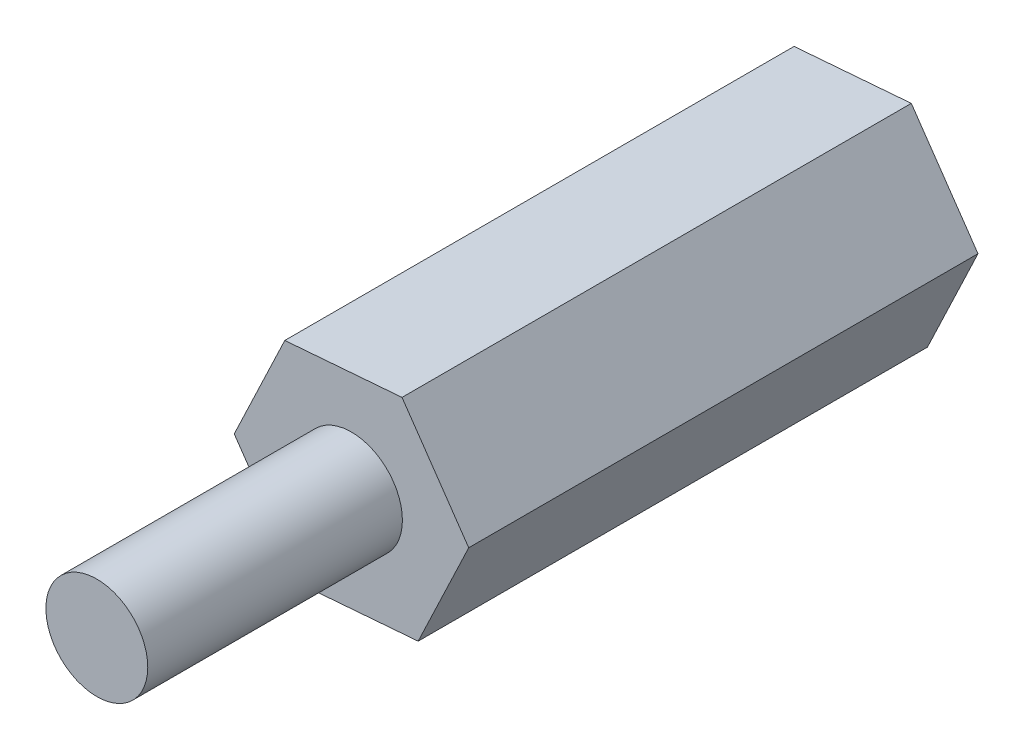
ISO-10303-21;
HEADER;
FILE_DESCRIPTION(('STEP AP214'),'2;1');
FILE_NAME('part.step','',(''),(''),'','','');
FILE_SCHEMA(('AUTOMOTIVE_DESIGN { 1 0 10303 214 1 1 1 1 }'));
ENDSEC;
DATA;
#1=APPLICATION_CONTEXT('core data for automotive mechanical design processes');
#2=APPLICATION_PROTOCOL_DEFINITION('international standard','automotive_design',2000,#1);
#3=PRODUCT_CONTEXT('',#1,'mechanical');
#4=PRODUCT('Part','Part','',(#3));
#5=PRODUCT_RELATED_PRODUCT_CATEGORY('part','',(#4));
#6=PRODUCT_DEFINITION_FORMATION('','',#4);
#7=PRODUCT_DEFINITION_CONTEXT('part definition',#1,'design');
#8=PRODUCT_DEFINITION('design','',#6,#7);
#9=PRODUCT_DEFINITION_SHAPE('','',#8);
#10=(LENGTH_UNIT() NAMED_UNIT(*) SI_UNIT(.MILLI.,.METRE.));
#11=(NAMED_UNIT(*) PLANE_ANGLE_UNIT() SI_UNIT($,.RADIAN.));
#12=(NAMED_UNIT(*) SI_UNIT($,.STERADIAN.) SOLID_ANGLE_UNIT());
#13=UNCERTAINTY_MEASURE_WITH_UNIT(LENGTH_MEASURE(1.E-05),#10,'distance_accuracy_value','');
#14=(GEOMETRIC_REPRESENTATION_CONTEXT(3) GLOBAL_UNCERTAINTY_ASSIGNED_CONTEXT((#13)) GLOBAL_UNIT_ASSIGNED_CONTEXT((#10,
#11,#12)) REPRESENTATION_CONTEXT('',''));
#15=CARTESIAN_POINT('',(0.,0.,0.));
#16=DIRECTION('',(0.,0.,1.));
#17=DIRECTION('',(1.,0.,0.));
#18=AXIS2_PLACEMENT_3D('',#15,#16,#17);
#19=CARTESIAN_POINT('',(1.30949428071029,-1.90225078843994,10.));
#20=DIRECTION('',(-0.90290973205585,0.429830217363592,0.));
#21=DIRECTION('',(-0.429830217363592,-0.90290973205585,0.));
#22=AXIS2_PLACEMENT_3D('',#19,#20,#21);
#23=PLANE('',#22);
#24=DIRECTION('',(0.429830217363592,0.90290973205585,0.));
#25=VECTOR('',#24,1.);
#26=CARTESIAN_POINT('',(1.30949428071029,-1.90225078843994,0.));
#27=LINE('',#26,#25);
#28=CARTESIAN_POINT('',(1.30949428071029,-1.90225078843994,0.));
#29=VERTEX_POINT('',#28);
#30=CARTESIAN_POINT('',(2.30214464751311,0.182929918985571,0.));
#31=VERTEX_POINT('',#30);
#32=EDGE_CURVE('E120',#29,#31,#27,.T.);
#33=ORIENTED_EDGE('',*,*,#32,.T.);
#34=DIRECTION('',(0.,0.,-1.));
#35=VECTOR('',#34,1.);
#36=CARTESIAN_POINT('',(2.30214464751311,0.182929918985571,10.));
#37=LINE('',#36,#35);
#38=CARTESIAN_POINT('',(2.30214464751311,0.182929918985571,10.));
#39=VERTEX_POINT('',#38);
#40=EDGE_CURVE('E37',#39,#31,#37,.T.);
#41=ORIENTED_EDGE('',*,*,#40,.F.);
#42=DIRECTION('',(0.429830217363592,0.90290973205585,0.));
#43=VECTOR('',#42,1.);
#44=CARTESIAN_POINT('',(1.30949428071029,-1.90225078843994,10.));
#45=LINE('',#44,#43);
#46=CARTESIAN_POINT('',(1.30949428071029,-1.90225078843994,10.));
#47=VERTEX_POINT('',#46);
#48=EDGE_CURVE('E131',#47,#39,#45,.T.);
#49=ORIENTED_EDGE('',*,*,#48,.F.);
#50=DIRECTION('',(0.,0.,-1.));
#51=VECTOR('',#50,1.);
#52=CARTESIAN_POINT('',(1.30949428071029,-1.90225078843994,10.));
#53=LINE('',#52,#51);
#54=EDGE_CURVE('E116',#47,#29,#53,.T.);
#55=ORIENTED_EDGE('',*,*,#54,.T.);
#56=EDGE_LOOP('',(#33,#41,#49,#55));
#57=FACE_BOUND('',#56,.T.);
#58=ADVANCED_FACE('F34',(#57),#23,.F.);
#59=CARTESIAN_POINT('',(2.30214464751311,0.182929918985571,10.));
#60=DIRECTION('',(-0.823698753578983,-0.56702765660277,0.));
#61=DIRECTION('',(0.56702765660277,-0.823698753578983,0.));
#62=AXIS2_PLACEMENT_3D('',#59,#60,#61);
#63=PLANE('',#62);
#64=DIRECTION('',(-0.56702765660277,0.823698753578983,0.));
#65=VECTOR('',#64,1.);
#66=CARTESIAN_POINT('',(2.30214464751311,0.182929918985571,0.));
#67=LINE('',#66,#65);
#68=CARTESIAN_POINT('',(0.992650366802822,2.08518070742551,0.));
#69=VERTEX_POINT('',#68);
#70=EDGE_CURVE('E123',#31,#69,#67,.T.);
#71=ORIENTED_EDGE('',*,*,#70,.T.);
#72=DIRECTION('',(0.,0.,-1.));
#73=VECTOR('',#72,1.);
#74=CARTESIAN_POINT('',(0.992650366802822,2.08518070742551,10.));
#75=LINE('',#74,#73);
#76=CARTESIAN_POINT('',(0.992650366802822,2.08518070742551,10.));
#77=VERTEX_POINT('',#76);
#78=EDGE_CURVE('E134',#77,#69,#75,.T.);
#79=ORIENTED_EDGE('',*,*,#78,.F.);
#80=DIRECTION('',(-0.56702765660277,0.823698753578983,0.));
#81=VECTOR('',#80,1.);
#82=CARTESIAN_POINT('',(2.30214464751311,0.182929918985571,10.));
#83=LINE('',#82,#81);
#84=EDGE_CURVE('E89',#39,#77,#83,.T.);
#85=ORIENTED_EDGE('',*,*,#84,.F.);
#86=ORIENTED_EDGE('',*,*,#40,.T.);
#87=EDGE_LOOP('',(#71,#79,#85,#86));
#88=FACE_BOUND('',#87,.T.);
#89=ADVANCED_FACE('F139',(#88),#63,.F.);
#90=CARTESIAN_POINT('',(0.992650366802822,2.08518070742551,10.));
#91=DIRECTION('',(0.0792109784768665,-0.996857873966363,0.));
#92=DIRECTION('',(0.996857873966363,0.0792109784768665,0.));
#93=AXIS2_PLACEMENT_3D('',#90,#91,#92);
#94=PLANE('',#93);
#95=DIRECTION('',(-0.996857873966363,-0.0792109784768665,0.));
#96=VECTOR('',#95,1.);
#97=CARTESIAN_POINT('',(0.992650366802822,2.08518070742551,0.));
#98=LINE('',#97,#96);
#99=CARTESIAN_POINT('',(-1.30949428071029,1.90225078843994,0.));
#100=VERTEX_POINT('',#99);
#101=EDGE_CURVE('E126',#69,#100,#98,.T.);
#102=ORIENTED_EDGE('',*,*,#101,.T.);
#103=DIRECTION('',(0.,0.,-1.));
#104=VECTOR('',#103,1.);
#105=CARTESIAN_POINT('',(-1.30949428071029,1.90225078843994,10.));
#106=LINE('',#105,#104);
#107=CARTESIAN_POINT('',(-1.30949428071029,1.90225078843994,10.));
#108=VERTEX_POINT('',#107);
#109=EDGE_CURVE('E111',#108,#100,#106,.T.);
#110=ORIENTED_EDGE('',*,*,#109,.F.);
#111=DIRECTION('',(-0.996857873966363,-0.0792109784768665,0.));
#112=VECTOR('',#111,1.);
#113=CARTESIAN_POINT('',(0.992650366802822,2.08518070742551,10.));
#114=LINE('',#113,#112);
#115=EDGE_CURVE('E102',#77,#108,#114,.T.);
#116=ORIENTED_EDGE('',*,*,#115,.F.);
#117=ORIENTED_EDGE('',*,*,#78,.T.);
#118=EDGE_LOOP('',(#102,#110,#116,#117));
#119=FACE_BOUND('',#118,.T.);
#120=ADVANCED_FACE('F145',(#119),#94,.F.);
#121=CARTESIAN_POINT('',(-1.30949428071029,1.90225078843994,10.));
#122=DIRECTION('',(0.90290973205585,-0.429830217363592,0.));
#123=DIRECTION('',(0.429830217363592,0.90290973205585,0.));
#124=AXIS2_PLACEMENT_3D('',#121,#122,#123);
#125=PLANE('',#124);
#126=DIRECTION('',(-0.429830217363592,-0.90290973205585,0.));
#127=VECTOR('',#126,1.);
#128=CARTESIAN_POINT('',(-1.30949428071029,1.90225078843994,0.));
#129=LINE('',#128,#127);
#130=CARTESIAN_POINT('',(-2.30214464751311,-0.182929918985571,0.));
#131=VERTEX_POINT('',#130);
#132=EDGE_CURVE('E110',#100,#131,#129,.T.);
#133=ORIENTED_EDGE('',*,*,#132,.T.);
#134=DIRECTION('',(0.,0.,-1.));
#135=VECTOR('',#134,1.);
#136=CARTESIAN_POINT('',(-2.30214464751311,-0.182929918985571,10.));
#137=LINE('',#136,#135);
#138=CARTESIAN_POINT('',(-2.30214464751311,-0.182929918985571,10.));
#139=VERTEX_POINT('',#138);
#140=EDGE_CURVE('E107',#139,#131,#137,.T.);
#141=ORIENTED_EDGE('',*,*,#140,.F.);
#142=DIRECTION('',(-0.429830217363592,-0.90290973205585,0.));
#143=VECTOR('',#142,1.);
#144=CARTESIAN_POINT('',(-1.30949428071029,1.90225078843994,10.));
#145=LINE('',#144,#143);
#146=EDGE_CURVE('E96',#108,#139,#145,.T.);
#147=ORIENTED_EDGE('',*,*,#146,.F.);
#148=ORIENTED_EDGE('',*,*,#109,.T.);
#149=EDGE_LOOP('',(#133,#141,#147,#148));
#150=FACE_BOUND('',#149,.T.);
#151=ADVANCED_FACE('F108',(#150),#125,.F.);
#152=CARTESIAN_POINT('',(-2.30214464751311,-0.182929918985571,10.));
#153=DIRECTION('',(0.823698753578983,0.56702765660277,0.));
#154=DIRECTION('',(-0.56702765660277,0.823698753578983,0.));
#155=AXIS2_PLACEMENT_3D('',#152,#153,#154);
#156=PLANE('',#155);
#157=DIRECTION('',(0.56702765660277,-0.823698753578983,0.));
#158=VECTOR('',#157,1.);
#159=CARTESIAN_POINT('',(-2.30214464751311,-0.182929918985571,0.));
#160=LINE('',#159,#158);
#161=CARTESIAN_POINT('',(-0.992650366802821,-2.08518070742551,0.));
#162=VERTEX_POINT('',#161);
#163=EDGE_CURVE('E74',#131,#162,#160,.T.);
#164=ORIENTED_EDGE('',*,*,#163,.T.);
#165=DIRECTION('',(0.,0.,-1.));
#166=VECTOR('',#165,1.);
#167=CARTESIAN_POINT('',(-0.992650366802821,-2.08518070742551,10.));
#168=LINE('',#167,#166);
#169=CARTESIAN_POINT('',(-0.992650366802821,-2.08518070742551,10.));
#170=VERTEX_POINT('',#169);
#171=EDGE_CURVE('E112',#170,#162,#168,.T.);
#172=ORIENTED_EDGE('',*,*,#171,.F.);
#173=DIRECTION('',(0.56702765660277,-0.823698753578983,0.));
#174=VECTOR('',#173,1.);
#175=CARTESIAN_POINT('',(-2.30214464751311,-0.182929918985571,10.));
#176=LINE('',#175,#174);
#177=EDGE_CURVE('E100',#139,#170,#176,.T.);
#178=ORIENTED_EDGE('',*,*,#177,.F.);
#179=ORIENTED_EDGE('',*,*,#140,.T.);
#180=EDGE_LOOP('',(#164,#172,#178,#179));
#181=FACE_BOUND('',#180,.T.);
#182=ADVANCED_FACE('F114',(#181),#156,.F.);
#183=CARTESIAN_POINT('',(-0.992650366802821,-2.08518070742551,10.));
#184=DIRECTION('',(-0.0792109784768666,0.996857873966363,0.));
#185=DIRECTION('',(-0.996857873966363,-0.0792109784768666,0.));
#186=AXIS2_PLACEMENT_3D('',#183,#184,#185);
#187=PLANE('',#186);
#188=DIRECTION('',(0.996857873966363,0.0792109784768666,0.));
#189=VECTOR('',#188,1.);
#190=CARTESIAN_POINT('',(-0.992650366802821,-2.08518070742551,0.));
#191=LINE('',#190,#189);
#192=EDGE_CURVE('E80',#162,#29,#191,.T.);
#193=ORIENTED_EDGE('',*,*,#192,.T.);
#194=ORIENTED_EDGE('',*,*,#54,.F.);
#195=DIRECTION('',(0.996857873966363,0.0792109784768666,0.));
#196=VECTOR('',#195,1.);
#197=CARTESIAN_POINT('',(-0.992650366802821,-2.08518070742551,10.));
#198=LINE('',#197,#196);
#199=EDGE_CURVE('E51',#170,#47,#198,.T.);
#200=ORIENTED_EDGE('',*,*,#199,.F.);
#201=ORIENTED_EDGE('',*,*,#171,.T.);
#202=EDGE_LOOP('',(#193,#194,#200,#201));
#203=FACE_BOUND('',#202,.T.);
#204=ADVANCED_FACE('F176',(#203),#187,.F.);
#205=CARTESIAN_POINT('',(0.,0.,10.));
#206=DIRECTION('',(0.,0.,1.));
#207=DIRECTION('',(1.,0.,0.));
#208=AXIS2_PLACEMENT_3D('',#205,#206,#207);
#209=PLANE('',#208);
#210=CARTESIAN_POINT('',(0.,0.,10.));
#211=DIRECTION('',(0.,0.,1.));
#212=DIRECTION('',(1.,0.,0.));
#213=AXIS2_PLACEMENT_3D('',#210,#211,#212);
#214=CIRCLE('',#213,1.);
#215=CARTESIAN_POINT('',(1.,0.,10.));
#216=VERTEX_POINT('',#215);
#217=EDGE_CURVE('E11',#216,#216,#214,.T.);
#218=ORIENTED_EDGE('',*,*,#217,.F.);
#219=EDGE_LOOP('',(#218));
#220=FACE_BOUND('',#219,.T.);
#221=ORIENTED_EDGE('',*,*,#48,.T.);
#222=ORIENTED_EDGE('',*,*,#84,.T.);
#223=ORIENTED_EDGE('',*,*,#115,.T.);
#224=ORIENTED_EDGE('',*,*,#146,.T.);
#225=ORIENTED_EDGE('',*,*,#177,.T.);
#226=ORIENTED_EDGE('',*,*,#199,.T.);
#227=EDGE_LOOP('',(#221,#222,#223,#224,#225,#226));
#228=FACE_BOUND('',#227,.T.);
#229=ADVANCED_FACE('F98',(#220,#228),#209,.T.);
#230=CARTESIAN_POINT('',(0.,0.,0.));
#231=DIRECTION('',(0.,0.,1.));
#232=DIRECTION('',(1.,0.,0.));
#233=AXIS2_PLACEMENT_3D('',#230,#231,#232);
#234=PLANE('',#233);
#235=CARTESIAN_POINT('',(0.,0.,0.));
#236=DIRECTION('',(0.,0.,-1.));
#237=DIRECTION('',(-1.,0.,0.));
#238=AXIS2_PLACEMENT_3D('',#235,#236,#237);
#239=CIRCLE('',#238,1.);
#240=CARTESIAN_POINT('',(-1.,0.,0.));
#241=VERTEX_POINT('',#240);
#242=EDGE_CURVE('E152',#241,#241,#239,.T.);
#243=ORIENTED_EDGE('',*,*,#242,.F.);
#244=EDGE_LOOP('',(#243));
#245=FACE_BOUND('',#244,.T.);
#246=ORIENTED_EDGE('',*,*,#32,.F.);
#247=ORIENTED_EDGE('',*,*,#192,.F.);
#248=ORIENTED_EDGE('',*,*,#163,.F.);
#249=ORIENTED_EDGE('',*,*,#132,.F.);
#250=ORIENTED_EDGE('',*,*,#101,.F.);
#251=ORIENTED_EDGE('',*,*,#70,.F.);
#252=EDGE_LOOP('',(#246,#247,#248,#249,#250,#251));
#253=FACE_BOUND('',#252,.T.);
#254=ADVANCED_FACE('F144',(#245,#253),#234,.F.);
#255=CARTESIAN_POINT('',(0.,0.,15.));
#256=DIRECTION('',(0.,0.,-1.));
#257=DIRECTION('',(-1.,0.,0.));
#258=AXIS2_PLACEMENT_3D('',#255,#256,#257);
#259=CYLINDRICAL_SURFACE('',#258,1.);
#260=CARTESIAN_POINT('',(0.,0.,15.));
#261=DIRECTION('',(0.,0.,1.));
#262=DIRECTION('',(1.,0.,0.));
#263=AXIS2_PLACEMENT_3D('',#260,#261,#262);
#264=CIRCLE('',#263,1.);
#265=CARTESIAN_POINT('',(1.,0.,15.));
#266=VERTEX_POINT('',#265);
#267=EDGE_CURVE('E124',#266,#266,#264,.T.);
#268=ORIENTED_EDGE('',*,*,#267,.F.);
#269=EDGE_LOOP('',(#268));
#270=FACE_BOUND('',#269,.T.);
#271=ORIENTED_EDGE('',*,*,#217,.T.);
#272=EDGE_LOOP('',(#271));
#273=FACE_BOUND('',#272,.T.);
#274=ADVANCED_FACE('F168',(#270,#273),#259,.T.);
#275=CARTESIAN_POINT('',(0.,0.,15.));
#276=DIRECTION('',(0.,0.,1.));
#277=DIRECTION('',(1.,0.,0.));
#278=AXIS2_PLACEMENT_3D('',#275,#276,#277);
#279=PLANE('',#278);
#280=ORIENTED_EDGE('',*,*,#267,.T.);
#281=EDGE_LOOP('',(#280));
#282=FACE_BOUND('',#281,.T.);
#283=ADVANCED_FACE('F163',(#282),#279,.T.);
#284=CARTESIAN_POINT('',(0.,0.,5.));
#285=DIRECTION('',(0.,0.,-1.));
#286=DIRECTION('',(-1.,0.,0.));
#287=AXIS2_PLACEMENT_3D('',#284,#285,#286);
#288=CYLINDRICAL_SURFACE('',#287,1.);
#289=CARTESIAN_POINT('',(0.,0.,5.));
#290=DIRECTION('',(0.,0.,-1.));
#291=DIRECTION('',(-1.,0.,0.));
#292=AXIS2_PLACEMENT_3D('',#289,#290,#291);
#293=CIRCLE('',#292,1.);
#294=CARTESIAN_POINT('',(-1.,0.,5.));
#295=VERTEX_POINT('',#294);
#296=EDGE_CURVE('E151',#295,#295,#293,.T.);
#297=ORIENTED_EDGE('',*,*,#296,.F.);
#298=EDGE_LOOP('',(#297));
#299=FACE_BOUND('',#298,.T.);
#300=ORIENTED_EDGE('',*,*,#242,.T.);
#301=EDGE_LOOP('',(#300));
#302=FACE_BOUND('',#301,.T.);
#303=ADVANCED_FACE('F160',(#299,#302),#288,.F.);
#304=CARTESIAN_POINT('',(0.,0.,5.));
#305=DIRECTION('',(0.,0.,-1.));
#306=DIRECTION('',(-1.,0.,0.));
#307=AXIS2_PLACEMENT_3D('',#304,#305,#306);
#308=PLANE('',#307);
#309=ORIENTED_EDGE('',*,*,#296,.T.);
#310=EDGE_LOOP('',(#309));
#311=FACE_BOUND('',#310,.T.);
#312=ADVANCED_FACE('F158',(#311),#308,.T.);
#313=CLOSED_SHELL('',(#58,#89,#120,#151,#182,#204,#229,#254,#274,#283,#303,#312));
#314=MANIFOLD_SOLID_BREP('B2',#313);
#315=ADVANCED_BREP_SHAPE_REPRESENTATION('',(#18,#314),#14);
#316=SHAPE_DEFINITION_REPRESENTATION(#9,#315);
ENDSEC;
END-ISO-10303-21;
